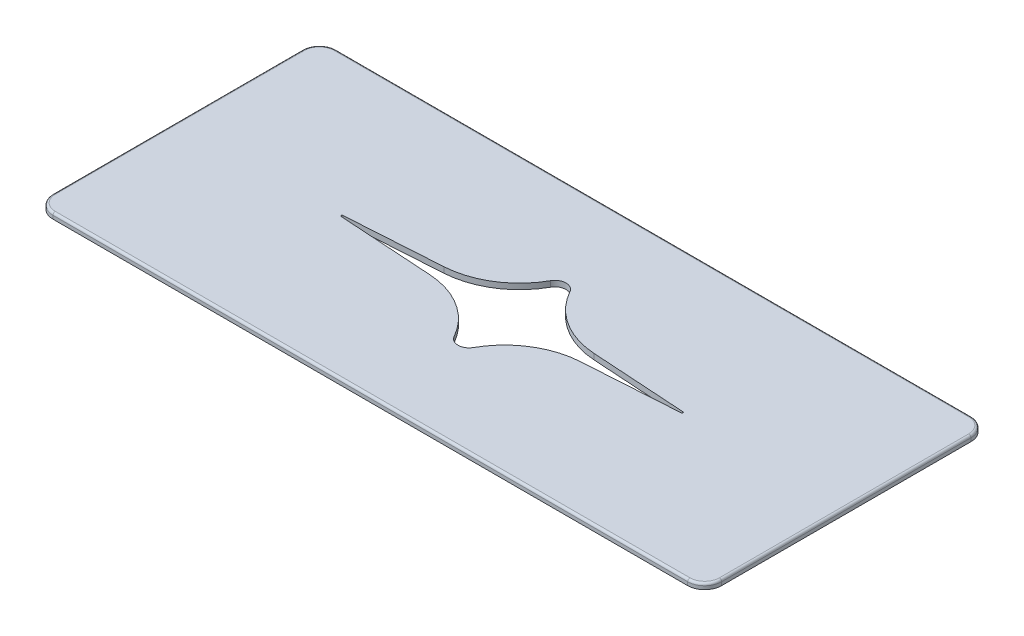
ISO-10303-21;
HEADER;
FILE_DESCRIPTION(('STEP AP214'),'2;1');
FILE_NAME('part.step','',(''),(''),'','','');
FILE_SCHEMA(('AUTOMOTIVE_DESIGN { 1 0 10303 214 1 1 1 1 }'));
ENDSEC;
DATA;
#1=APPLICATION_CONTEXT('core data for automotive mechanical design processes');
#2=APPLICATION_PROTOCOL_DEFINITION('international standard','automotive_design',2000,#1);
#3=PRODUCT_CONTEXT('',#1,'mechanical');
#4=PRODUCT('Part','Part','',(#3));
#5=PRODUCT_RELATED_PRODUCT_CATEGORY('part','',(#4));
#6=PRODUCT_DEFINITION_FORMATION('','',#4);
#7=PRODUCT_DEFINITION_CONTEXT('part definition',#1,'design');
#8=PRODUCT_DEFINITION('design','',#6,#7);
#9=PRODUCT_DEFINITION_SHAPE('','',#8);
#10=(LENGTH_UNIT() NAMED_UNIT(*) SI_UNIT(.MILLI.,.METRE.));
#11=(NAMED_UNIT(*) PLANE_ANGLE_UNIT() SI_UNIT($,.RADIAN.));
#12=(NAMED_UNIT(*) SI_UNIT($,.STERADIAN.) SOLID_ANGLE_UNIT());
#13=UNCERTAINTY_MEASURE_WITH_UNIT(LENGTH_MEASURE(1.E-05),#10,'distance_accuracy_value','');
#14=(GEOMETRIC_REPRESENTATION_CONTEXT(3) GLOBAL_UNCERTAINTY_ASSIGNED_CONTEXT((#13)) GLOBAL_UNIT_ASSIGNED_CONTEXT((#10,
#11,#12)) REPRESENTATION_CONTEXT('',''));
#15=CARTESIAN_POINT('',(0.,0.,0.));
#16=DIRECTION('',(0.,0.,1.));
#17=DIRECTION('',(1.,0.,0.));
#18=AXIS2_PLACEMENT_3D('',#15,#16,#17);
#19=CARTESIAN_POINT('',(0.,2.5,0.));
#20=DIRECTION('',(0.,1.,0.));
#21=DIRECTION('',(0.,0.,1.));
#22=AXIS2_PLACEMENT_3D('',#19,#20,#21);
#23=PLANE('',#22);
#24=DIRECTION('',(0.,0.,-1.));
#25=VECTOR('',#24,1.);
#26=CARTESIAN_POINT('',(146.5,2.5,-55.));
#27=LINE('',#26,#25);
#28=CARTESIAN_POINT('',(146.5,2.5,55.));
#29=VERTEX_POINT('',#28);
#30=CARTESIAN_POINT('',(146.5,2.5,-55.));
#31=VERTEX_POINT('',#30);
#32=EDGE_CURVE('E405',#29,#31,#27,.T.);
#33=ORIENTED_EDGE('',*,*,#32,.T.);
#34=CARTESIAN_POINT('',(140.,2.5,-55.));
#35=DIRECTION('',(0.,1.,0.));
#36=DIRECTION('',(0.,0.,1.));
#37=AXIS2_PLACEMENT_3D('',#34,#35,#36);
#38=CIRCLE('',#37,6.5);
#39=CARTESIAN_POINT('',(140.,2.5,-61.5));
#40=VERTEX_POINT('',#39);
#41=EDGE_CURVE('E407',#31,#40,#38,.T.);
#42=ORIENTED_EDGE('',*,*,#41,.T.);
#43=DIRECTION('',(-1.,0.,0.));
#44=VECTOR('',#43,1.);
#45=CARTESIAN_POINT('',(-140.,2.5,-61.5));
#46=LINE('',#45,#44);
#47=CARTESIAN_POINT('',(-140.,2.5,-61.5));
#48=VERTEX_POINT('',#47);
#49=EDGE_CURVE('E393',#40,#48,#46,.T.);
#50=ORIENTED_EDGE('',*,*,#49,.T.);
#51=CARTESIAN_POINT('',(-140.,2.5,-55.));
#52=DIRECTION('',(0.,1.,0.));
#53=DIRECTION('',(0.,0.,1.));
#54=AXIS2_PLACEMENT_3D('',#51,#52,#53);
#55=CIRCLE('',#54,6.5);
#56=CARTESIAN_POINT('',(-146.5,2.5,-55.));
#57=VERTEX_POINT('',#56);
#58=EDGE_CURVE('E395',#48,#57,#55,.T.);
#59=ORIENTED_EDGE('',*,*,#58,.T.);
#60=DIRECTION('',(0.,0.,1.));
#61=VECTOR('',#60,1.);
#62=CARTESIAN_POINT('',(-146.5,2.5,55.));
#63=LINE('',#62,#61);
#64=CARTESIAN_POINT('',(-146.5,2.5,55.));
#65=VERTEX_POINT('',#64);
#66=EDGE_CURVE('E397',#57,#65,#63,.T.);
#67=ORIENTED_EDGE('',*,*,#66,.T.);
#68=CARTESIAN_POINT('',(-140.,2.5,55.));
#69=DIRECTION('',(0.,1.,0.));
#70=DIRECTION('',(0.,0.,1.));
#71=AXIS2_PLACEMENT_3D('',#68,#69,#70);
#72=CIRCLE('',#71,6.5);
#73=CARTESIAN_POINT('',(-140.,2.5,61.5));
#74=VERTEX_POINT('',#73);
#75=EDGE_CURVE('E399',#65,#74,#72,.T.);
#76=ORIENTED_EDGE('',*,*,#75,.T.);
#77=DIRECTION('',(1.,0.,0.));
#78=VECTOR('',#77,1.);
#79=CARTESIAN_POINT('',(140.,2.5,61.5));
#80=LINE('',#79,#78);
#81=CARTESIAN_POINT('',(140.,2.5,61.5));
#82=VERTEX_POINT('',#81);
#83=EDGE_CURVE('E401',#74,#82,#80,.T.);
#84=ORIENTED_EDGE('',*,*,#83,.T.);
#85=CARTESIAN_POINT('',(140.,2.5,55.));
#86=DIRECTION('',(0.,1.,0.));
#87=DIRECTION('',(0.,0.,1.));
#88=AXIS2_PLACEMENT_3D('',#85,#86,#87);
#89=CIRCLE('',#88,6.5);
#90=EDGE_CURVE('E403',#82,#29,#89,.T.);
#91=ORIENTED_EDGE('',*,*,#90,.T.);
#92=EDGE_LOOP('',(#33,#42,#50,#59,#67,#76,#84,#91));
#93=FACE_BOUND('',#92,.T.);
#94=CARTESIAN_POINT('',(-35.3572614126249,2.5,-38.6331815305869));
#95=DIRECTION('',(0.,1.,0.));
#96=DIRECTION('',(0.,0.,1.));
#97=AXIS2_PLACEMENT_3D('',#94,#95,#96);
#98=CIRCLE('',#97,35.6164328417568);
#99=CARTESIAN_POINT('',(-33.0739983476834,2.5,-3.09001062325728));
#100=VERTEX_POINT('',#99);
#101=CARTESIAN_POINT('',(-4.23670454704912,2.5,-21.3114833243533));
#102=VERTEX_POINT('',#101);
#103=EDGE_CURVE('E324',#100,#102,#98,.T.);
#104=ORIENTED_EDGE('',*,*,#103,.T.);
#105=CARTESIAN_POINT('',(0.,2.5,-18.9533340833241));
#106=DIRECTION('',(0.,1.,0.));
#107=DIRECTION('',(0.,0.,1.));
#108=AXIS2_PLACEMENT_3D('',#105,#106,#107);
#109=CIRCLE('',#108,4.8487661587205);
#110=CARTESIAN_POINT('',(4.23670454704912,2.5,-21.3114833243533));
#111=VERTEX_POINT('',#110);
#112=EDGE_CURVE('E321',#102,#111,#109,.F.);
#113=ORIENTED_EDGE('',*,*,#112,.T.);
#114=CARTESIAN_POINT('',(35.3572614126249,2.5,-38.6331815305869));
#115=DIRECTION('',(0.,1.,0.));
#116=DIRECTION('',(0.,0.,1.));
#117=AXIS2_PLACEMENT_3D('',#114,#115,#116);
#118=CIRCLE('',#117,35.6164328417568);
#119=CARTESIAN_POINT('',(33.0739983476834,2.5,-3.09001062325728));
#120=VERTEX_POINT('',#119);
#121=EDGE_CURVE('E318',#120,#111,#118,.F.);
#122=ORIENTED_EDGE('',*,*,#121,.F.);
#123=DIRECTION('',(-0.997943029984147,0.,-0.0641070113642781));
#124=VECTOR('',#123,1.);
#125=CARTESIAN_POINT('',(0.333608383749961,2.5,-5.19322542452917));
#126=LINE('',#125,#124);
#127=CARTESIAN_POINT('',(75.0253802157955,2.5,-0.395089537221983));
#128=VERTEX_POINT('',#127);
#129=EDGE_CURVE('E315',#128,#120,#126,.T.);
#130=ORIENTED_EDGE('',*,*,#129,.F.);
#131=CARTESIAN_POINT('',(75.,2.5,0.));
#132=DIRECTION('',(0.,-1.,0.));
#133=DIRECTION('',(0.,0.,-1.));
#134=AXIS2_PLACEMENT_3D('',#131,#132,#133);
#135=CIRCLE('',#134,0.39590389967277);
#136=CARTESIAN_POINT('',(75.0253802157955,2.5,0.395089537221983));
#137=VERTEX_POINT('',#136);
#138=EDGE_CURVE('E349',#128,#137,#135,.T.);
#139=ORIENTED_EDGE('',*,*,#138,.T.);
#140=DIRECTION('',(-0.997943029984147,0.,0.0641070113642781));
#141=VECTOR('',#140,1.);
#142=CARTESIAN_POINT('',(0.333608383749961,2.5,5.19322542452917));
#143=LINE('',#142,#141);
#144=CARTESIAN_POINT('',(33.0739983476834,2.5,3.09001062325728));
#145=VERTEX_POINT('',#144);
#146=EDGE_CURVE('E311',#137,#145,#143,.T.);
#147=ORIENTED_EDGE('',*,*,#146,.T.);
#148=CARTESIAN_POINT('',(35.3572614126249,2.5,38.6331815305869));
#149=DIRECTION('',(0.,1.,0.));
#150=DIRECTION('',(0.,0.,1.));
#151=AXIS2_PLACEMENT_3D('',#148,#149,#150);
#152=CIRCLE('',#151,35.6164328417568);
#153=CARTESIAN_POINT('',(4.23670454704912,2.5,21.3114833243533));
#154=VERTEX_POINT('',#153);
#155=EDGE_CURVE('E309',#145,#154,#152,.T.);
#156=ORIENTED_EDGE('',*,*,#155,.T.);
#157=CARTESIAN_POINT('',(0.,2.5,18.9533340833241));
#158=DIRECTION('',(0.,1.,0.));
#159=DIRECTION('',(0.,0.,1.));
#160=AXIS2_PLACEMENT_3D('',#157,#158,#159);
#161=CIRCLE('',#160,4.8487661587205);
#162=CARTESIAN_POINT('',(-4.23670454704912,2.5,21.3114833243533));
#163=VERTEX_POINT('',#162);
#164=EDGE_CURVE('E287',#163,#154,#161,.T.);
#165=ORIENTED_EDGE('',*,*,#164,.F.);
#166=CARTESIAN_POINT('',(-35.3572614126249,2.5,38.6331815305869));
#167=DIRECTION('',(0.,1.,0.));
#168=DIRECTION('',(0.,0.,1.));
#169=AXIS2_PLACEMENT_3D('',#166,#167,#168);
#170=CIRCLE('',#169,35.6164328417568);
#171=CARTESIAN_POINT('',(-33.0739983476834,2.5,3.09001062325728));
#172=VERTEX_POINT('',#171);
#173=EDGE_CURVE('E297',#172,#163,#170,.F.);
#174=ORIENTED_EDGE('',*,*,#173,.F.);
#175=DIRECTION('',(0.997943029984147,0.,0.0641070113642781));
#176=VECTOR('',#175,1.);
#177=CARTESIAN_POINT('',(-0.333608383749961,2.5,5.19322542452917));
#178=LINE('',#177,#176);
#179=CARTESIAN_POINT('',(-75.0253802157955,2.5,0.395089537221983));
#180=VERTEX_POINT('',#179);
#181=EDGE_CURVE('E294',#180,#172,#178,.T.);
#182=ORIENTED_EDGE('',*,*,#181,.F.);
#183=CARTESIAN_POINT('',(-75.,2.5,0.));
#184=DIRECTION('',(0.,1.,0.));
#185=DIRECTION('',(0.,0.,1.));
#186=AXIS2_PLACEMENT_3D('',#183,#184,#185);
#187=CIRCLE('',#186,0.39590389967277);
#188=CARTESIAN_POINT('',(-75.0253802157955,2.5,-0.395089537221983));
#189=VERTEX_POINT('',#188);
#190=EDGE_CURVE('E304',#189,#180,#187,.T.);
#191=ORIENTED_EDGE('',*,*,#190,.F.);
#192=DIRECTION('',(0.997943029984147,0.,-0.0641070113642781));
#193=VECTOR('',#192,1.);
#194=CARTESIAN_POINT('',(-0.333608383749961,2.5,-5.19322542452917));
#195=LINE('',#194,#193);
#196=EDGE_CURVE('E136',#189,#100,#195,.T.);
#197=ORIENTED_EDGE('',*,*,#196,.T.);
#198=EDGE_LOOP('',(#104,#113,#122,#130,#139,#147,#156,#165,#174,#182,#191,#197));
#199=FACE_BOUND('',#198,.T.);
#200=ADVANCED_FACE('F121',(#93,#199),#23,.T.);
#201=CARTESIAN_POINT('',(0.,0.,0.));
#202=DIRECTION('',(0.,1.,0.));
#203=DIRECTION('',(0.,0.,1.));
#204=AXIS2_PLACEMENT_3D('',#201,#202,#203);
#205=PLANE('',#204);
#206=DIRECTION('',(0.,0.,-1.));
#207=VECTOR('',#206,1.);
#208=CARTESIAN_POINT('',(147.5,0.,-62.5));
#209=LINE('',#208,#207);
#210=CARTESIAN_POINT('',(147.5,0.,55.));
#211=VERTEX_POINT('',#210);
#212=CARTESIAN_POINT('',(147.5,0.,-55.));
#213=VERTEX_POINT('',#212);
#214=EDGE_CURVE('E352',#211,#213,#209,.T.);
#215=ORIENTED_EDGE('',*,*,#214,.F.);
#216=CARTESIAN_POINT('',(140.,0.,55.));
#217=DIRECTION('',(0.,1.,0.));
#218=DIRECTION('',(0.,0.,1.));
#219=AXIS2_PLACEMENT_3D('',#216,#217,#218);
#220=CIRCLE('',#219,7.5);
#221=CARTESIAN_POINT('',(140.,0.,62.5));
#222=VERTEX_POINT('',#221);
#223=EDGE_CURVE('E376',#211,#222,#220,.F.);
#224=ORIENTED_EDGE('',*,*,#223,.T.);
#225=DIRECTION('',(1.,0.,0.));
#226=VECTOR('',#225,1.);
#227=CARTESIAN_POINT('',(-147.5,0.,62.5));
#228=LINE('',#227,#226);
#229=CARTESIAN_POINT('',(-140.,0.,62.5));
#230=VERTEX_POINT('',#229);
#231=EDGE_CURVE('E362',#230,#222,#228,.T.);
#232=ORIENTED_EDGE('',*,*,#231,.F.);
#233=CARTESIAN_POINT('',(-140.,0.,55.));
#234=DIRECTION('',(0.,1.,0.));
#235=DIRECTION('',(0.,0.,1.));
#236=AXIS2_PLACEMENT_3D('',#233,#234,#235);
#237=CIRCLE('',#236,7.5);
#238=CARTESIAN_POINT('',(-147.5,0.,55.));
#239=VERTEX_POINT('',#238);
#240=EDGE_CURVE('E374',#230,#239,#237,.F.);
#241=ORIENTED_EDGE('',*,*,#240,.T.);
#242=DIRECTION('',(0.,0.,1.));
#243=VECTOR('',#242,1.);
#244=CARTESIAN_POINT('',(-147.5,0.,-62.5));
#245=LINE('',#244,#243);
#246=CARTESIAN_POINT('',(-147.5,0.,-55.));
#247=VERTEX_POINT('',#246);
#248=EDGE_CURVE('E359',#247,#239,#245,.T.);
#249=ORIENTED_EDGE('',*,*,#248,.F.);
#250=CARTESIAN_POINT('',(-140.,0.,-55.));
#251=DIRECTION('',(0.,1.,0.));
#252=DIRECTION('',(0.,0.,1.));
#253=AXIS2_PLACEMENT_3D('',#250,#251,#252);
#254=CIRCLE('',#253,7.5);
#255=CARTESIAN_POINT('',(-140.,0.,-62.5));
#256=VERTEX_POINT('',#255);
#257=EDGE_CURVE('E370',#247,#256,#254,.F.);
#258=ORIENTED_EDGE('',*,*,#257,.T.);
#259=DIRECTION('',(-1.,0.,0.));
#260=VECTOR('',#259,1.);
#261=CARTESIAN_POINT('',(-147.5,0.,-62.5));
#262=LINE('',#261,#260);
#263=CARTESIAN_POINT('',(140.,0.,-62.5));
#264=VERTEX_POINT('',#263);
#265=EDGE_CURVE('E355',#264,#256,#262,.T.);
#266=ORIENTED_EDGE('',*,*,#265,.F.);
#267=CARTESIAN_POINT('',(140.,0.,-55.));
#268=DIRECTION('',(0.,1.,0.));
#269=DIRECTION('',(0.,0.,1.));
#270=AXIS2_PLACEMENT_3D('',#267,#268,#269);
#271=CIRCLE('',#270,7.5);
#272=EDGE_CURVE('E372',#264,#213,#271,.F.);
#273=ORIENTED_EDGE('',*,*,#272,.T.);
#274=EDGE_LOOP('',(#215,#224,#232,#241,#249,#258,#266,#273));
#275=FACE_BOUND('',#274,.T.);
#276=CARTESIAN_POINT('',(0.,0.,-18.9533340833241));
#277=DIRECTION('',(0.,1.,0.));
#278=DIRECTION('',(0.,0.,1.));
#279=AXIS2_PLACEMENT_3D('',#276,#277,#278);
#280=CIRCLE('',#279,4.8487661587205);
#281=CARTESIAN_POINT('',(-4.23670454704912,0.,-21.3114833243533));
#282=VERTEX_POINT('',#281);
#283=CARTESIAN_POINT('',(4.23670454704912,0.,-21.3114833243533));
#284=VERTEX_POINT('',#283);
#285=EDGE_CURVE('E12',#282,#284,#280,.F.);
#286=ORIENTED_EDGE('',*,*,#285,.F.);
#287=CARTESIAN_POINT('',(-35.3572614126249,0.,-38.6331815305869));
#288=DIRECTION('',(0.,1.,0.));
#289=DIRECTION('',(0.,0.,1.));
#290=AXIS2_PLACEMENT_3D('',#287,#288,#289);
#291=CIRCLE('',#290,35.6164328417568);
#292=CARTESIAN_POINT('',(-33.0739983476834,0.,-3.09001062325728));
#293=VERTEX_POINT('',#292);
#294=EDGE_CURVE('E462',#293,#282,#291,.T.);
#295=ORIENTED_EDGE('',*,*,#294,.F.);
#296=DIRECTION('',(0.997943029984147,0.,-0.0641070113642781));
#297=VECTOR('',#296,1.);
#298=CARTESIAN_POINT('',(-0.333608383749961,0.,-5.19322542452917));
#299=LINE('',#298,#297);
#300=CARTESIAN_POINT('',(-75.0253802157955,0.,-0.395089537221983));
#301=VERTEX_POINT('',#300);
#302=EDGE_CURVE('E450',#301,#293,#299,.T.);
#303=ORIENTED_EDGE('',*,*,#302,.F.);
#304=CARTESIAN_POINT('',(-75.,0.,0.));
#305=DIRECTION('',(0.,1.,0.));
#306=DIRECTION('',(0.,0.,1.));
#307=AXIS2_PLACEMENT_3D('',#304,#305,#306);
#308=CIRCLE('',#307,0.39590389967277);
#309=CARTESIAN_POINT('',(-75.0253802157955,0.,0.395089537221983));
#310=VERTEX_POINT('',#309);
#311=EDGE_CURVE('E427',#301,#310,#308,.T.);
#312=ORIENTED_EDGE('',*,*,#311,.T.);
#313=DIRECTION('',(0.997943029984147,0.,0.0641070113642781));
#314=VECTOR('',#313,1.);
#315=CARTESIAN_POINT('',(-0.333608383749961,0.,5.19322542452917));
#316=LINE('',#315,#314);
#317=CARTESIAN_POINT('',(-33.0739983476834,0.,3.09001062325728));
#318=VERTEX_POINT('',#317);
#319=EDGE_CURVE('E452',#310,#318,#316,.T.);
#320=ORIENTED_EDGE('',*,*,#319,.T.);
#321=CARTESIAN_POINT('',(-35.3572614126249,0.,38.6331815305869));
#322=DIRECTION('',(0.,1.,0.));
#323=DIRECTION('',(0.,0.,1.));
#324=AXIS2_PLACEMENT_3D('',#321,#322,#323);
#325=CIRCLE('',#324,35.6164328417568);
#326=CARTESIAN_POINT('',(-4.23670454704912,0.,21.3114833243533));
#327=VERTEX_POINT('',#326);
#328=EDGE_CURVE('E455',#318,#327,#325,.F.);
#329=ORIENTED_EDGE('',*,*,#328,.T.);
#330=CARTESIAN_POINT('',(0.,0.,18.9533340833241));
#331=DIRECTION('',(0.,1.,0.));
#332=DIRECTION('',(0.,0.,1.));
#333=AXIS2_PLACEMENT_3D('',#330,#331,#332);
#334=CIRCLE('',#333,4.8487661587205);
#335=CARTESIAN_POINT('',(4.23670454704912,0.,21.3114833243533));
#336=VERTEX_POINT('',#335);
#337=EDGE_CURVE('E290',#327,#336,#334,.T.);
#338=ORIENTED_EDGE('',*,*,#337,.T.);
#339=CARTESIAN_POINT('',(35.3572614126249,0.,38.6331815305869));
#340=DIRECTION('',(0.,1.,0.));
#341=DIRECTION('',(0.,0.,1.));
#342=AXIS2_PLACEMENT_3D('',#339,#340,#341);
#343=CIRCLE('',#342,35.6164328417568);
#344=CARTESIAN_POINT('',(33.0739983476834,0.,3.09001062325728));
#345=VERTEX_POINT('',#344);
#346=EDGE_CURVE('E458',#345,#336,#343,.T.);
#347=ORIENTED_EDGE('',*,*,#346,.F.);
#348=DIRECTION('',(-0.997943029984147,0.,0.0641070113642781));
#349=VECTOR('',#348,1.);
#350=CARTESIAN_POINT('',(0.333608383749961,0.,5.19322542452917));
#351=LINE('',#350,#349);
#352=CARTESIAN_POINT('',(75.0253802157955,0.,0.395089537221983));
#353=VERTEX_POINT('',#352);
#354=EDGE_CURVE('E460',#353,#345,#351,.T.);
#355=ORIENTED_EDGE('',*,*,#354,.F.);
#356=CARTESIAN_POINT('',(75.,0.,0.));
#357=DIRECTION('',(0.,1.,0.));
#358=DIRECTION('',(0.,0.,1.));
#359=AXIS2_PLACEMENT_3D('',#356,#357,#358);
#360=CIRCLE('',#359,0.39590389967277);
#361=CARTESIAN_POINT('',(75.0253802157955,0.,-0.395089537221983));
#362=VERTEX_POINT('',#361);
#363=EDGE_CURVE('E464',#362,#353,#360,.F.);
#364=ORIENTED_EDGE('',*,*,#363,.F.);
#365=DIRECTION('',(-0.997943029984147,0.,-0.0641070113642781));
#366=VECTOR('',#365,1.);
#367=CARTESIAN_POINT('',(0.333608383749961,0.,-5.19322542452917));
#368=LINE('',#367,#366);
#369=CARTESIAN_POINT('',(33.0739983476834,0.,-3.09001062325728));
#370=VERTEX_POINT('',#369);
#371=EDGE_CURVE('E466',#362,#370,#368,.T.);
#372=ORIENTED_EDGE('',*,*,#371,.T.);
#373=CARTESIAN_POINT('',(35.3572614126249,0.,-38.6331815305869));
#374=DIRECTION('',(0.,1.,0.));
#375=DIRECTION('',(0.,0.,1.));
#376=AXIS2_PLACEMENT_3D('',#373,#374,#375);
#377=CIRCLE('',#376,35.6164328417568);
#378=EDGE_CURVE('E129',#370,#284,#377,.F.);
#379=ORIENTED_EDGE('',*,*,#378,.T.);
#380=EDGE_LOOP('',(#286,#295,#303,#312,#320,#329,#338,#347,#355,#364,#372,#379));
#381=FACE_BOUND('',#380,.T.);
#382=ADVANCED_FACE('F471',(#275,#381),#205,.F.);
#383=CARTESIAN_POINT('',(147.5,2.5,-62.5));
#384=DIRECTION('',(-1.,0.,0.));
#385=DIRECTION('',(0.,0.,1.));
#386=AXIS2_PLACEMENT_3D('',#383,#384,#385);
#387=PLANE('',#386);
#388=DIRECTION('',(0.,-1.,0.));
#389=VECTOR('',#388,1.);
#390=CARTESIAN_POINT('',(147.5,2.5,-55.));
#391=LINE('',#390,#389);
#392=CARTESIAN_POINT('',(147.5,1.5,-55.));
#393=VERTEX_POINT('',#392);
#394=EDGE_CURVE('E365',#213,#393,#391,.F.);
#395=ORIENTED_EDGE('',*,*,#394,.T.);
#396=DIRECTION('',(0.,0.,-1.));
#397=VECTOR('',#396,1.);
#398=CARTESIAN_POINT('',(147.5,1.5,55.));
#399=LINE('',#398,#397);
#400=CARTESIAN_POINT('',(147.5,1.5,55.));
#401=VERTEX_POINT('',#400);
#402=EDGE_CURVE('E413',#393,#401,#399,.F.);
#403=ORIENTED_EDGE('',*,*,#402,.T.);
#404=DIRECTION('',(0.,-1.,0.));
#405=VECTOR('',#404,1.);
#406=CARTESIAN_POINT('',(147.5,2.5,55.));
#407=LINE('',#406,#405);
#408=EDGE_CURVE('E368',#401,#211,#407,.T.);
#409=ORIENTED_EDGE('',*,*,#408,.T.);
#410=ORIENTED_EDGE('',*,*,#214,.T.);
#411=EDGE_LOOP('',(#395,#403,#409,#410));
#412=FACE_BOUND('',#411,.T.);
#413=ADVANCED_FACE('F524',(#412),#387,.F.);
#414=CARTESIAN_POINT('',(-147.5,2.5,-62.5));
#415=DIRECTION('',(0.,0.,1.));
#416=DIRECTION('',(1.,0.,0.));
#417=AXIS2_PLACEMENT_3D('',#414,#415,#416);
#418=PLANE('',#417);
#419=DIRECTION('',(0.,-1.,0.));
#420=VECTOR('',#419,1.);
#421=CARTESIAN_POINT('',(-140.,2.5,-62.5));
#422=LINE('',#421,#420);
#423=CARTESIAN_POINT('',(-140.,1.5,-62.5));
#424=VERTEX_POINT('',#423);
#425=EDGE_CURVE('E388',#256,#424,#422,.F.);
#426=ORIENTED_EDGE('',*,*,#425,.T.);
#427=DIRECTION('',(-1.,0.,0.));
#428=VECTOR('',#427,1.);
#429=CARTESIAN_POINT('',(140.,1.5,-62.5));
#430=LINE('',#429,#428);
#431=CARTESIAN_POINT('',(140.,1.5,-62.5));
#432=VERTEX_POINT('',#431);
#433=EDGE_CURVE('E425',#424,#432,#430,.F.);
#434=ORIENTED_EDGE('',*,*,#433,.T.);
#435=DIRECTION('',(0.,-1.,0.));
#436=VECTOR('',#435,1.);
#437=CARTESIAN_POINT('',(140.,2.5,-62.5));
#438=LINE('',#437,#436);
#439=EDGE_CURVE('E391',#432,#264,#438,.T.);
#440=ORIENTED_EDGE('',*,*,#439,.T.);
#441=ORIENTED_EDGE('',*,*,#265,.T.);
#442=EDGE_LOOP('',(#426,#434,#440,#441));
#443=FACE_BOUND('',#442,.T.);
#444=ADVANCED_FACE('F536',(#443),#418,.F.);
#445=CARTESIAN_POINT('',(-147.5,2.5,-62.5));
#446=DIRECTION('',(1.,0.,0.));
#447=DIRECTION('',(0.,0.,-1.));
#448=AXIS2_PLACEMENT_3D('',#445,#446,#447);
#449=PLANE('',#448);
#450=DIRECTION('',(0.,-1.,0.));
#451=VECTOR('',#450,1.);
#452=CARTESIAN_POINT('',(-147.5,2.5,55.));
#453=LINE('',#452,#451);
#454=CARTESIAN_POINT('',(-147.5,1.5,55.));
#455=VERTEX_POINT('',#454);
#456=EDGE_CURVE('E385',#239,#455,#453,.F.);
#457=ORIENTED_EDGE('',*,*,#456,.T.);
#458=DIRECTION('',(0.,0.,1.));
#459=VECTOR('',#458,1.);
#460=CARTESIAN_POINT('',(-147.5,1.5,-55.));
#461=LINE('',#460,#459);
#462=CARTESIAN_POINT('',(-147.5,1.5,-55.));
#463=VERTEX_POINT('',#462);
#464=EDGE_CURVE('E421',#455,#463,#461,.F.);
#465=ORIENTED_EDGE('',*,*,#464,.T.);
#466=DIRECTION('',(0.,-1.,0.));
#467=VECTOR('',#466,1.);
#468=CARTESIAN_POINT('',(-147.5,2.5,-55.));
#469=LINE('',#468,#467);
#470=EDGE_CURVE('E383',#463,#247,#469,.T.);
#471=ORIENTED_EDGE('',*,*,#470,.T.);
#472=ORIENTED_EDGE('',*,*,#248,.T.);
#473=EDGE_LOOP('',(#457,#465,#471,#472));
#474=FACE_BOUND('',#473,.T.);
#475=ADVANCED_FACE('F532',(#474),#449,.F.);
#476=CARTESIAN_POINT('',(-147.5,2.5,62.5));
#477=DIRECTION('',(0.,0.,-1.));
#478=DIRECTION('',(-1.,0.,0.));
#479=AXIS2_PLACEMENT_3D('',#476,#477,#478);
#480=PLANE('',#479);
#481=DIRECTION('',(0.,-1.,0.));
#482=VECTOR('',#481,1.);
#483=CARTESIAN_POINT('',(140.,2.5,62.5));
#484=LINE('',#483,#482);
#485=CARTESIAN_POINT('',(140.,1.5,62.5));
#486=VERTEX_POINT('',#485);
#487=EDGE_CURVE('E380',#222,#486,#484,.F.);
#488=ORIENTED_EDGE('',*,*,#487,.T.);
#489=DIRECTION('',(1.,0.,0.));
#490=VECTOR('',#489,1.);
#491=CARTESIAN_POINT('',(-140.,1.5,62.5));
#492=LINE('',#491,#490);
#493=CARTESIAN_POINT('',(-140.,1.5,62.5));
#494=VERTEX_POINT('',#493);
#495=EDGE_CURVE('E417',#486,#494,#492,.F.);
#496=ORIENTED_EDGE('',*,*,#495,.T.);
#497=DIRECTION('',(0.,-1.,0.));
#498=VECTOR('',#497,1.);
#499=CARTESIAN_POINT('',(-140.,2.5,62.5));
#500=LINE('',#499,#498);
#501=EDGE_CURVE('E378',#494,#230,#500,.T.);
#502=ORIENTED_EDGE('',*,*,#501,.T.);
#503=ORIENTED_EDGE('',*,*,#231,.T.);
#504=EDGE_LOOP('',(#488,#496,#502,#503));
#505=FACE_BOUND('',#504,.T.);
#506=ADVANCED_FACE('F528',(#505),#480,.F.);
#507=CARTESIAN_POINT('',(140.,2.5,55.));
#508=DIRECTION('',(0.,-1.,0.));
#509=DIRECTION('',(0.,0.,-1.));
#510=AXIS2_PLACEMENT_3D('',#507,#508,#509);
#511=CYLINDRICAL_SURFACE('',#510,7.5);
#512=ORIENTED_EDGE('',*,*,#408,.F.);
#513=CARTESIAN_POINT('',(140.,1.5,55.));
#514=DIRECTION('',(0.,1.,0.));
#515=DIRECTION('',(0.,0.,1.));
#516=AXIS2_PLACEMENT_3D('',#513,#514,#515);
#517=CIRCLE('',#516,7.5);
#518=EDGE_CURVE('E415',#401,#486,#517,.F.);
#519=ORIENTED_EDGE('',*,*,#518,.T.);
#520=ORIENTED_EDGE('',*,*,#487,.F.);
#521=ORIENTED_EDGE('',*,*,#223,.F.);
#522=EDGE_LOOP('',(#512,#519,#520,#521));
#523=FACE_BOUND('',#522,.T.);
#524=ADVANCED_FACE('F531',(#523),#511,.T.);
#525=CARTESIAN_POINT('',(-140.,2.5,55.));
#526=DIRECTION('',(0.,-1.,0.));
#527=DIRECTION('',(0.,0.,-1.));
#528=AXIS2_PLACEMENT_3D('',#525,#526,#527);
#529=CYLINDRICAL_SURFACE('',#528,7.5);
#530=ORIENTED_EDGE('',*,*,#501,.F.);
#531=CARTESIAN_POINT('',(-140.,1.5,55.));
#532=DIRECTION('',(0.,1.,0.));
#533=DIRECTION('',(0.,0.,1.));
#534=AXIS2_PLACEMENT_3D('',#531,#532,#533);
#535=CIRCLE('',#534,7.5);
#536=EDGE_CURVE('E419',#494,#455,#535,.F.);
#537=ORIENTED_EDGE('',*,*,#536,.T.);
#538=ORIENTED_EDGE('',*,*,#456,.F.);
#539=ORIENTED_EDGE('',*,*,#240,.F.);
#540=EDGE_LOOP('',(#530,#537,#538,#539));
#541=FACE_BOUND('',#540,.T.);
#542=ADVANCED_FACE('F546',(#541),#529,.T.);
#543=CARTESIAN_POINT('',(140.,2.5,-55.));
#544=DIRECTION('',(0.,-1.,0.));
#545=DIRECTION('',(0.,0.,-1.));
#546=AXIS2_PLACEMENT_3D('',#543,#544,#545);
#547=CYLINDRICAL_SURFACE('',#546,7.5);
#548=ORIENTED_EDGE('',*,*,#439,.F.);
#549=CARTESIAN_POINT('',(140.,1.5,-55.));
#550=DIRECTION('',(0.,1.,0.));
#551=DIRECTION('',(0.,0.,1.));
#552=AXIS2_PLACEMENT_3D('',#549,#550,#551);
#553=CIRCLE('',#552,7.5);
#554=EDGE_CURVE('E410',#432,#393,#553,.F.);
#555=ORIENTED_EDGE('',*,*,#554,.T.);
#556=ORIENTED_EDGE('',*,*,#394,.F.);
#557=ORIENTED_EDGE('',*,*,#272,.F.);
#558=EDGE_LOOP('',(#548,#555,#556,#557));
#559=FACE_BOUND('',#558,.T.);
#560=ADVANCED_FACE('F550',(#559),#547,.T.);
#561=CARTESIAN_POINT('',(-140.,2.5,-55.));
#562=DIRECTION('',(0.,-1.,0.));
#563=DIRECTION('',(0.,0.,-1.));
#564=AXIS2_PLACEMENT_3D('',#561,#562,#563);
#565=CYLINDRICAL_SURFACE('',#564,7.5);
#566=ORIENTED_EDGE('',*,*,#470,.F.);
#567=CARTESIAN_POINT('',(-140.,1.5,-55.));
#568=DIRECTION('',(0.,1.,0.));
#569=DIRECTION('',(0.,0.,1.));
#570=AXIS2_PLACEMENT_3D('',#567,#568,#569);
#571=CIRCLE('',#570,7.5);
#572=EDGE_CURVE('E423',#463,#424,#571,.F.);
#573=ORIENTED_EDGE('',*,*,#572,.T.);
#574=ORIENTED_EDGE('',*,*,#425,.F.);
#575=ORIENTED_EDGE('',*,*,#257,.F.);
#576=EDGE_LOOP('',(#566,#573,#574,#575));
#577=FACE_BOUND('',#576,.T.);
#578=ADVANCED_FACE('F554',(#577),#565,.T.);
#579=CARTESIAN_POINT('',(-140.,1.5,55.));
#580=DIRECTION('',(0.,1.,0.));
#581=DIRECTION('',(0.,0.,1.));
#582=AXIS2_PLACEMENT_3D('',#579,#580,#581);
#583=TOROIDAL_SURFACE('',#582,6.5,1.);
#584=CARTESIAN_POINT('',(-146.5,1.5,55.));
#585=DIRECTION('',(0.,0.,-1.));
#586=DIRECTION('',(-1.,0.,0.));
#587=AXIS2_PLACEMENT_3D('',#584,#585,#586);
#588=CIRCLE('',#587,1.);
#589=EDGE_CURVE('E443',#455,#65,#588,.T.);
#590=ORIENTED_EDGE('',*,*,#589,.F.);
#591=ORIENTED_EDGE('',*,*,#536,.F.);
#592=CARTESIAN_POINT('',(-140.,1.5,61.5));
#593=DIRECTION('',(1.,0.,0.));
#594=DIRECTION('',(0.,0.,-1.));
#595=AXIS2_PLACEMENT_3D('',#592,#593,#594);
#596=CIRCLE('',#595,1.);
#597=EDGE_CURVE('E356',#74,#494,#596,.T.);
#598=ORIENTED_EDGE('',*,*,#597,.F.);
#599=ORIENTED_EDGE('',*,*,#75,.F.);
#600=EDGE_LOOP('',(#590,#591,#598,#599));
#601=FACE_BOUND('',#600,.T.);
#602=ADVANCED_FACE('F123',(#601),#583,.T.);
#603=CARTESIAN_POINT('',(0.,1.5,61.5));
#604=DIRECTION('',(-1.,0.,0.));
#605=DIRECTION('',(0.,0.,1.));
#606=AXIS2_PLACEMENT_3D('',#603,#604,#605);
#607=CYLINDRICAL_SURFACE('',#606,1.);
#608=ORIENTED_EDGE('',*,*,#597,.T.);
#609=ORIENTED_EDGE('',*,*,#495,.F.);
#610=CARTESIAN_POINT('',(140.,1.5,61.5));
#611=DIRECTION('',(1.,0.,0.));
#612=DIRECTION('',(0.,0.,-1.));
#613=AXIS2_PLACEMENT_3D('',#610,#611,#612);
#614=CIRCLE('',#613,1.);
#615=EDGE_CURVE('E440',#82,#486,#614,.T.);
#616=ORIENTED_EDGE('',*,*,#615,.F.);
#617=ORIENTED_EDGE('',*,*,#83,.F.);
#618=EDGE_LOOP('',(#608,#609,#616,#617));
#619=FACE_BOUND('',#618,.T.);
#620=ADVANCED_FACE('F580',(#619),#607,.T.);
#621=CARTESIAN_POINT('',(-146.5,1.5,0.));
#622=DIRECTION('',(0.,0.,-1.));
#623=DIRECTION('',(-1.,0.,0.));
#624=AXIS2_PLACEMENT_3D('',#621,#622,#623);
#625=CYLINDRICAL_SURFACE('',#624,1.);
#626=ORIENTED_EDGE('',*,*,#589,.T.);
#627=ORIENTED_EDGE('',*,*,#66,.F.);
#628=CARTESIAN_POINT('',(-146.5,1.5,-55.));
#629=DIRECTION('',(0.,0.,-1.));
#630=DIRECTION('',(-1.,0.,0.));
#631=AXIS2_PLACEMENT_3D('',#628,#629,#630);
#632=CIRCLE('',#631,1.);
#633=EDGE_CURVE('E437',#463,#57,#632,.T.);
#634=ORIENTED_EDGE('',*,*,#633,.F.);
#635=ORIENTED_EDGE('',*,*,#464,.F.);
#636=EDGE_LOOP('',(#626,#627,#634,#635));
#637=FACE_BOUND('',#636,.T.);
#638=ADVANCED_FACE('F577',(#637),#625,.T.);
#639=CARTESIAN_POINT('',(140.,1.5,55.));
#640=DIRECTION('',(0.,1.,0.));
#641=DIRECTION('',(0.,0.,1.));
#642=AXIS2_PLACEMENT_3D('',#639,#640,#641);
#643=TOROIDAL_SURFACE('',#642,6.5,1.);
#644=ORIENTED_EDGE('',*,*,#615,.T.);
#645=ORIENTED_EDGE('',*,*,#518,.F.);
#646=CARTESIAN_POINT('',(146.5,1.5,55.));
#647=DIRECTION('',(0.,0.,-1.));
#648=DIRECTION('',(-1.,0.,0.));
#649=AXIS2_PLACEMENT_3D('',#646,#647,#648);
#650=CIRCLE('',#649,1.);
#651=EDGE_CURVE('E434',#29,#401,#650,.T.);
#652=ORIENTED_EDGE('',*,*,#651,.F.);
#653=ORIENTED_EDGE('',*,*,#90,.F.);
#654=EDGE_LOOP('',(#644,#645,#652,#653));
#655=FACE_BOUND('',#654,.T.);
#656=ADVANCED_FACE('F573',(#655),#643,.T.);
#657=CARTESIAN_POINT('',(-140.,1.5,-55.));
#658=DIRECTION('',(0.,1.,0.));
#659=DIRECTION('',(0.,0.,1.));
#660=AXIS2_PLACEMENT_3D('',#657,#658,#659);
#661=TOROIDAL_SURFACE('',#660,6.5,1.);
#662=ORIENTED_EDGE('',*,*,#633,.T.);
#663=ORIENTED_EDGE('',*,*,#58,.F.);
#664=CARTESIAN_POINT('',(-140.,1.5,-61.5));
#665=DIRECTION('',(1.,0.,0.));
#666=DIRECTION('',(0.,0.,-1.));
#667=AXIS2_PLACEMENT_3D('',#664,#665,#666);
#668=CIRCLE('',#667,1.);
#669=EDGE_CURVE('E431',#424,#48,#668,.T.);
#670=ORIENTED_EDGE('',*,*,#669,.F.);
#671=ORIENTED_EDGE('',*,*,#572,.F.);
#672=EDGE_LOOP('',(#662,#663,#670,#671));
#673=FACE_BOUND('',#672,.T.);
#674=ADVANCED_FACE('F569',(#673),#661,.T.);
#675=CARTESIAN_POINT('',(146.5,1.5,0.));
#676=DIRECTION('',(0.,0.,1.));
#677=DIRECTION('',(1.,0.,0.));
#678=AXIS2_PLACEMENT_3D('',#675,#676,#677);
#679=CYLINDRICAL_SURFACE('',#678,1.);
#680=ORIENTED_EDGE('',*,*,#651,.T.);
#681=ORIENTED_EDGE('',*,*,#402,.F.);
#682=CARTESIAN_POINT('',(146.5,1.5,-55.));
#683=DIRECTION('',(0.,0.,-1.));
#684=DIRECTION('',(-1.,0.,0.));
#685=AXIS2_PLACEMENT_3D('',#682,#683,#684);
#686=CIRCLE('',#685,1.);
#687=EDGE_CURVE('E429',#31,#393,#686,.T.);
#688=ORIENTED_EDGE('',*,*,#687,.F.);
#689=ORIENTED_EDGE('',*,*,#32,.F.);
#690=EDGE_LOOP('',(#680,#681,#688,#689));
#691=FACE_BOUND('',#690,.T.);
#692=ADVANCED_FACE('F565',(#691),#679,.T.);
#693=CARTESIAN_POINT('',(0.,1.5,-61.5));
#694=DIRECTION('',(1.,0.,0.));
#695=DIRECTION('',(0.,0.,-1.));
#696=AXIS2_PLACEMENT_3D('',#693,#694,#695);
#697=CYLINDRICAL_SURFACE('',#696,1.);
#698=ORIENTED_EDGE('',*,*,#669,.T.);
#699=ORIENTED_EDGE('',*,*,#49,.F.);
#700=CARTESIAN_POINT('',(140.,1.5,-61.5));
#701=DIRECTION('',(1.,0.,0.));
#702=DIRECTION('',(0.,0.,-1.));
#703=AXIS2_PLACEMENT_3D('',#700,#701,#702);
#704=CIRCLE('',#703,1.);
#705=EDGE_CURVE('E329',#432,#40,#704,.T.);
#706=ORIENTED_EDGE('',*,*,#705,.F.);
#707=ORIENTED_EDGE('',*,*,#433,.F.);
#708=EDGE_LOOP('',(#698,#699,#706,#707));
#709=FACE_BOUND('',#708,.T.);
#710=ADVANCED_FACE('F561',(#709),#697,.T.);
#711=CARTESIAN_POINT('',(140.,1.5,-55.));
#712=DIRECTION('',(0.,1.,0.));
#713=DIRECTION('',(0.,0.,1.));
#714=AXIS2_PLACEMENT_3D('',#711,#712,#713);
#715=TOROIDAL_SURFACE('',#714,6.5,1.);
#716=ORIENTED_EDGE('',*,*,#687,.T.);
#717=ORIENTED_EDGE('',*,*,#554,.F.);
#718=ORIENTED_EDGE('',*,*,#705,.T.);
#719=ORIENTED_EDGE('',*,*,#41,.F.);
#720=EDGE_LOOP('',(#716,#717,#718,#719));
#721=FACE_BOUND('',#720,.T.);
#722=ADVANCED_FACE('F559',(#721),#715,.T.);
#723=CARTESIAN_POINT('',(-0.333608383749961,-7.5,5.19322542452917));
#724=DIRECTION('',(-0.0641070113642781,0.,0.997943029984147));
#725=DIRECTION('',(0.997943029984147,0.,0.0641070113642781));
#726=AXIS2_PLACEMENT_3D('',#723,#724,#725);
#727=PLANE('',#726);
#728=DIRECTION('',(0.,1.,0.));
#729=VECTOR('',#728,1.);
#730=CARTESIAN_POINT('',(-75.0253802157955,-7.5,0.395089537221983));
#731=LINE('',#730,#729);
#732=EDGE_CURVE('E144',#310,#180,#731,.T.);
#733=ORIENTED_EDGE('',*,*,#732,.T.);
#734=ORIENTED_EDGE('',*,*,#181,.T.);
#735=DIRECTION('',(0.,1.,0.));
#736=VECTOR('',#735,1.);
#737=CARTESIAN_POINT('',(-33.0739983476834,-7.5,3.09001062325728));
#738=LINE('',#737,#736);
#739=EDGE_CURVE('E300',#318,#172,#738,.T.);
#740=ORIENTED_EDGE('',*,*,#739,.F.);
#741=ORIENTED_EDGE('',*,*,#319,.F.);
#742=EDGE_LOOP('',(#733,#734,#740,#741));
#743=FACE_BOUND('',#742,.T.);
#744=ADVANCED_FACE('F497',(#743),#727,.F.);
#745=CARTESIAN_POINT('',(-0.333608383749961,-7.5,-5.19322542452917));
#746=DIRECTION('',(0.0641070113642781,0.,0.997943029984147));
#747=DIRECTION('',(0.997943029984147,0.,-0.0641070113642781));
#748=AXIS2_PLACEMENT_3D('',#745,#746,#747);
#749=PLANE('',#748);
#750=ORIENTED_EDGE('',*,*,#302,.T.);
#751=DIRECTION('',(0.,1.,0.));
#752=VECTOR('',#751,1.);
#753=CARTESIAN_POINT('',(-33.0739983476834,-7.5,-3.09001062325728));
#754=LINE('',#753,#752);
#755=EDGE_CURVE('E333',#293,#100,#754,.T.);
#756=ORIENTED_EDGE('',*,*,#755,.T.);
#757=ORIENTED_EDGE('',*,*,#196,.F.);
#758=DIRECTION('',(0.,1.,0.));
#759=VECTOR('',#758,1.);
#760=CARTESIAN_POINT('',(-75.0253802157955,-7.5,-0.395089537221983));
#761=LINE('',#760,#759);
#762=EDGE_CURVE('E331',#301,#189,#761,.T.);
#763=ORIENTED_EDGE('',*,*,#762,.F.);
#764=EDGE_LOOP('',(#750,#756,#757,#763));
#765=FACE_BOUND('',#764,.T.);
#766=ADVANCED_FACE('F493',(#765),#749,.T.);
#767=CARTESIAN_POINT('',(-35.3572614126249,-7.5,-38.6331815305869));
#768=DIRECTION('',(0.,1.,0.));
#769=DIRECTION('',(0.,0.,1.));
#770=AXIS2_PLACEMENT_3D('',#767,#768,#769);
#771=CYLINDRICAL_SURFACE('',#770,35.6164328417568);
#772=ORIENTED_EDGE('',*,*,#294,.T.);
#773=DIRECTION('',(0.,1.,0.));
#774=VECTOR('',#773,1.);
#775=CARTESIAN_POINT('',(-4.23670454704912,-7.5,-21.3114833243533));
#776=LINE('',#775,#774);
#777=EDGE_CURVE('E335',#282,#102,#776,.T.);
#778=ORIENTED_EDGE('',*,*,#777,.T.);
#779=ORIENTED_EDGE('',*,*,#103,.F.);
#780=ORIENTED_EDGE('',*,*,#755,.F.);
#781=EDGE_LOOP('',(#772,#778,#779,#780));
#782=FACE_BOUND('',#781,.T.);
#783=ADVANCED_FACE('F490',(#782),#771,.T.);
#784=CARTESIAN_POINT('',(0.,-7.5,-18.9533340833241));
#785=DIRECTION('',(0.,1.,0.));
#786=DIRECTION('',(0.,0.,1.));
#787=AXIS2_PLACEMENT_3D('',#784,#785,#786);
#788=CYLINDRICAL_SURFACE('',#787,4.8487661587205);
#789=ORIENTED_EDGE('',*,*,#285,.T.);
#790=DIRECTION('',(0.,1.,0.));
#791=VECTOR('',#790,1.);
#792=CARTESIAN_POINT('',(4.23670454704912,-7.5,-21.3114833243533));
#793=LINE('',#792,#791);
#794=EDGE_CURVE('E337',#284,#111,#793,.T.);
#795=ORIENTED_EDGE('',*,*,#794,.T.);
#796=ORIENTED_EDGE('',*,*,#112,.F.);
#797=ORIENTED_EDGE('',*,*,#777,.F.);
#798=EDGE_LOOP('',(#789,#795,#796,#797));
#799=FACE_BOUND('',#798,.T.);
#800=ADVANCED_FACE('F488',(#799),#788,.F.);
#801=CARTESIAN_POINT('',(35.3572614126249,-7.5,-38.6331815305869));
#802=DIRECTION('',(0.,1.,0.));
#803=DIRECTION('',(0.,0.,1.));
#804=AXIS2_PLACEMENT_3D('',#801,#802,#803);
#805=CYLINDRICAL_SURFACE('',#804,35.6164328417568);
#806=DIRECTION('',(0.,1.,0.));
#807=VECTOR('',#806,1.);
#808=CARTESIAN_POINT('',(33.0739983476834,-7.5,-3.09001062325728));
#809=LINE('',#808,#807);
#810=EDGE_CURVE('E339',#370,#120,#809,.T.);
#811=ORIENTED_EDGE('',*,*,#810,.T.);
#812=ORIENTED_EDGE('',*,*,#121,.T.);
#813=ORIENTED_EDGE('',*,*,#794,.F.);
#814=ORIENTED_EDGE('',*,*,#378,.F.);
#815=EDGE_LOOP('',(#811,#812,#813,#814));
#816=FACE_BOUND('',#815,.T.);
#817=ADVANCED_FACE('F477',(#816),#805,.T.);
#818=CARTESIAN_POINT('',(0.333608383749961,-7.5,-5.19322542452917));
#819=DIRECTION('',(0.0641070113642781,0.,-0.997943029984147));
#820=DIRECTION('',(-0.997943029984147,0.,-0.0641070113642781));
#821=AXIS2_PLACEMENT_3D('',#818,#819,#820);
#822=PLANE('',#821);
#823=DIRECTION('',(0.,1.,0.));
#824=VECTOR('',#823,1.);
#825=CARTESIAN_POINT('',(75.0253802157955,-7.5,-0.395089537221983));
#826=LINE('',#825,#824);
#827=EDGE_CURVE('E341',#362,#128,#826,.T.);
#828=ORIENTED_EDGE('',*,*,#827,.T.);
#829=ORIENTED_EDGE('',*,*,#129,.T.);
#830=ORIENTED_EDGE('',*,*,#810,.F.);
#831=ORIENTED_EDGE('',*,*,#371,.F.);
#832=EDGE_LOOP('',(#828,#829,#830,#831));
#833=FACE_BOUND('',#832,.T.);
#834=ADVANCED_FACE('F479',(#833),#822,.F.);
#835=CARTESIAN_POINT('',(0.333608383749961,-7.5,5.19322542452917));
#836=DIRECTION('',(-0.0641070113642781,0.,-0.997943029984147));
#837=DIRECTION('',(-0.997943029984147,0.,0.0641070113642781));
#838=AXIS2_PLACEMENT_3D('',#835,#836,#837);
#839=PLANE('',#838);
#840=ORIENTED_EDGE('',*,*,#354,.T.);
#841=DIRECTION('',(0.,1.,0.));
#842=VECTOR('',#841,1.);
#843=CARTESIAN_POINT('',(33.0739983476834,-7.5,3.09001062325728));
#844=LINE('',#843,#842);
#845=EDGE_CURVE('E345',#345,#145,#844,.T.);
#846=ORIENTED_EDGE('',*,*,#845,.T.);
#847=ORIENTED_EDGE('',*,*,#146,.F.);
#848=DIRECTION('',(0.,1.,0.));
#849=VECTOR('',#848,1.);
#850=CARTESIAN_POINT('',(75.0253802157955,-7.5,0.395089537221983));
#851=LINE('',#850,#849);
#852=EDGE_CURVE('E343',#353,#137,#851,.T.);
#853=ORIENTED_EDGE('',*,*,#852,.F.);
#854=EDGE_LOOP('',(#840,#846,#847,#853));
#855=FACE_BOUND('',#854,.T.);
#856=ADVANCED_FACE('F505',(#855),#839,.T.);
#857=CARTESIAN_POINT('',(35.3572614126249,-7.5,38.6331815305869));
#858=DIRECTION('',(0.,1.,0.));
#859=DIRECTION('',(0.,0.,1.));
#860=AXIS2_PLACEMENT_3D('',#857,#858,#859);
#861=CYLINDRICAL_SURFACE('',#860,35.6164328417568);
#862=ORIENTED_EDGE('',*,*,#346,.T.);
#863=DIRECTION('',(0.,1.,0.));
#864=VECTOR('',#863,1.);
#865=CARTESIAN_POINT('',(4.23670454704912,-7.5,21.3114833243533));
#866=LINE('',#865,#864);
#867=EDGE_CURVE('E293',#336,#154,#866,.T.);
#868=ORIENTED_EDGE('',*,*,#867,.T.);
#869=ORIENTED_EDGE('',*,*,#155,.F.);
#870=ORIENTED_EDGE('',*,*,#845,.F.);
#871=EDGE_LOOP('',(#862,#868,#869,#870));
#872=FACE_BOUND('',#871,.T.);
#873=ADVANCED_FACE('F502',(#872),#861,.T.);
#874=CARTESIAN_POINT('',(0.,-7.5,18.9533340833241));
#875=DIRECTION('',(0.,1.,0.));
#876=DIRECTION('',(0.,0.,1.));
#877=AXIS2_PLACEMENT_3D('',#874,#875,#876);
#878=CYLINDRICAL_SURFACE('',#877,4.8487661587205);
#879=DIRECTION('',(0.,1.,0.));
#880=VECTOR('',#879,1.);
#881=CARTESIAN_POINT('',(-4.23670454704912,-7.5,21.3114833243533));
#882=LINE('',#881,#880);
#883=EDGE_CURVE('E282',#327,#163,#882,.T.);
#884=ORIENTED_EDGE('',*,*,#883,.T.);
#885=ORIENTED_EDGE('',*,*,#164,.T.);
#886=ORIENTED_EDGE('',*,*,#867,.F.);
#887=ORIENTED_EDGE('',*,*,#337,.F.);
#888=EDGE_LOOP('',(#884,#885,#886,#887));
#889=FACE_BOUND('',#888,.T.);
#890=ADVANCED_FACE('F284',(#889),#878,.F.);
#891=CARTESIAN_POINT('',(-35.3572614126249,-7.5,38.6331815305869));
#892=DIRECTION('',(0.,1.,0.));
#893=DIRECTION('',(0.,0.,1.));
#894=AXIS2_PLACEMENT_3D('',#891,#892,#893);
#895=CYLINDRICAL_SURFACE('',#894,35.6164328417568);
#896=ORIENTED_EDGE('',*,*,#739,.T.);
#897=ORIENTED_EDGE('',*,*,#173,.T.);
#898=ORIENTED_EDGE('',*,*,#883,.F.);
#899=ORIENTED_EDGE('',*,*,#328,.F.);
#900=EDGE_LOOP('',(#896,#897,#898,#899));
#901=FACE_BOUND('',#900,.T.);
#902=ADVANCED_FACE('F298',(#901),#895,.T.);
#903=CARTESIAN_POINT('',(75.,-7.5,0.));
#904=DIRECTION('',(0.,1.,0.));
#905=DIRECTION('',(0.,0.,1.));
#906=AXIS2_PLACEMENT_3D('',#903,#904,#905);
#907=CYLINDRICAL_SURFACE('',#906,0.39590389967277);
#908=ORIENTED_EDGE('',*,*,#363,.T.);
#909=ORIENTED_EDGE('',*,*,#852,.T.);
#910=ORIENTED_EDGE('',*,*,#138,.F.);
#911=ORIENTED_EDGE('',*,*,#827,.F.);
#912=EDGE_LOOP('',(#908,#909,#910,#911));
#913=FACE_BOUND('',#912,.T.);
#914=ADVANCED_FACE('F508',(#913),#907,.F.);
#915=CARTESIAN_POINT('',(-75.,-7.5,0.));
#916=DIRECTION('',(0.,1.,0.));
#917=DIRECTION('',(0.,0.,1.));
#918=AXIS2_PLACEMENT_3D('',#915,#916,#917);
#919=CYLINDRICAL_SURFACE('',#918,0.39590389967277);
#920=ORIENTED_EDGE('',*,*,#762,.T.);
#921=ORIENTED_EDGE('',*,*,#190,.T.);
#922=ORIENTED_EDGE('',*,*,#732,.F.);
#923=ORIENTED_EDGE('',*,*,#311,.F.);
#924=EDGE_LOOP('',(#920,#921,#922,#923));
#925=FACE_BOUND('',#924,.T.);
#926=ADVANCED_FACE('F495',(#925),#919,.F.);
#927=CLOSED_SHELL('',(#200,#382,#413,#444,#475,#506,#524,#542,#560,#578,#602,#620,#638,#656,
#674,#692,#710,#722,#744,#766,#783,#800,#817,#834,#856,#873,#890,#902,#914,#926));
#928=MANIFOLD_SOLID_BREP('B2',#927);
#929=ADVANCED_BREP_SHAPE_REPRESENTATION('',(#18,#928),#14);
#930=SHAPE_DEFINITION_REPRESENTATION(#9,#929);
ENDSEC;
END-ISO-10303-21;
